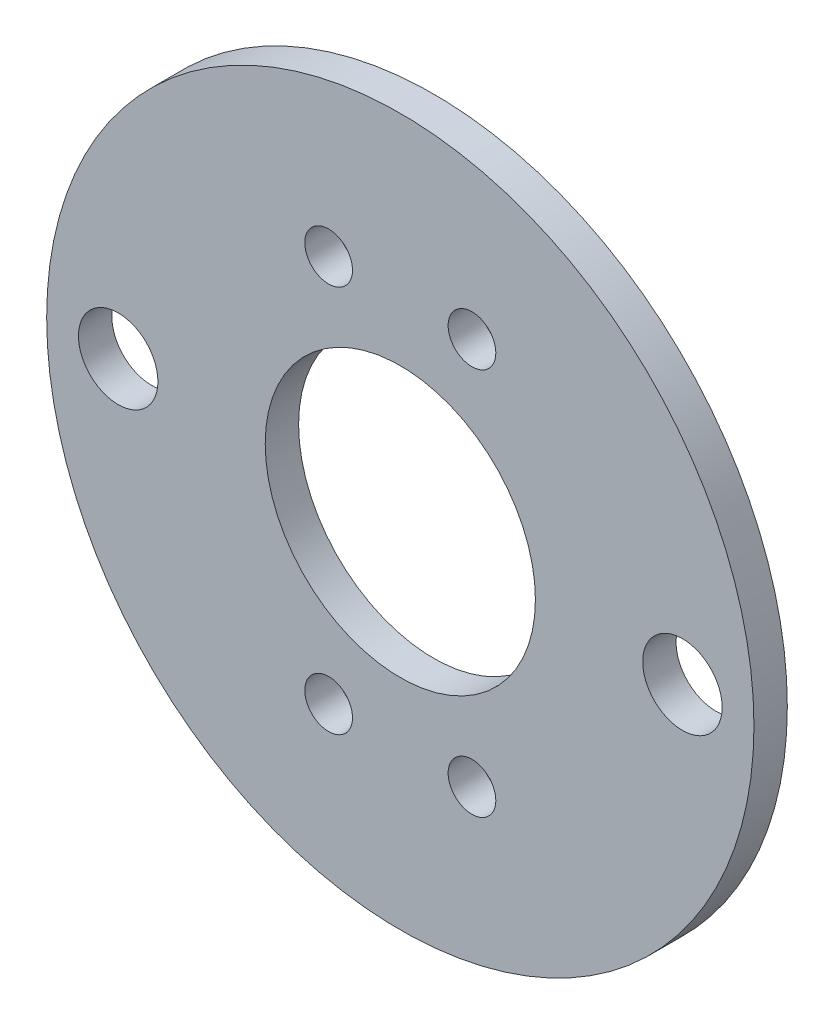
ISO-10303-21;
HEADER;
FILE_DESCRIPTION(('STEP AP214'),'2;1');
FILE_NAME('part.step','',(''),(''),'','','');
FILE_SCHEMA(('AUTOMOTIVE_DESIGN { 1 0 10303 214 1 1 1 1 }'));
ENDSEC;
DATA;
#1=APPLICATION_CONTEXT('core data for automotive mechanical design processes');
#2=APPLICATION_PROTOCOL_DEFINITION('international standard','automotive_design',2000,#1);
#3=PRODUCT_CONTEXT('',#1,'mechanical');
#4=PRODUCT('Part','Part','',(#3));
#5=PRODUCT_RELATED_PRODUCT_CATEGORY('part','',(#4));
#6=PRODUCT_DEFINITION_FORMATION('','',#4);
#7=PRODUCT_DEFINITION_CONTEXT('part definition',#1,'design');
#8=PRODUCT_DEFINITION('design','',#6,#7);
#9=PRODUCT_DEFINITION_SHAPE('','',#8);
#10=(LENGTH_UNIT() NAMED_UNIT(*) SI_UNIT(.MILLI.,.METRE.));
#11=(NAMED_UNIT(*) PLANE_ANGLE_UNIT() SI_UNIT($,.RADIAN.));
#12=(NAMED_UNIT(*) SI_UNIT($,.STERADIAN.) SOLID_ANGLE_UNIT());
#13=UNCERTAINTY_MEASURE_WITH_UNIT(LENGTH_MEASURE(1.E-05),#10,'distance_accuracy_value','');
#14=(GEOMETRIC_REPRESENTATION_CONTEXT(3) GLOBAL_UNCERTAINTY_ASSIGNED_CONTEXT((#13)) GLOBAL_UNIT_ASSIGNED_CONTEXT((#10,
#11,#12)) REPRESENTATION_CONTEXT('',''));
#15=CARTESIAN_POINT('',(0.,0.,0.));
#16=DIRECTION('',(0.,0.,1.));
#17=DIRECTION('',(1.,0.,0.));
#18=AXIS2_PLACEMENT_3D('',#15,#16,#17);
#19=CARTESIAN_POINT('',(1.09092304692803E-13,0.,2.1));
#20=DIRECTION('',(0.,0.,-1.));
#21=DIRECTION('',(-1.,0.,0.));
#22=AXIS2_PLACEMENT_3D('',#19,#20,#21);
#23=CYLINDRICAL_SURFACE('',#22,8.50000000000012);
#24=CARTESIAN_POINT('',(1.09092304692803E-13,0.,2.1));
#25=DIRECTION('',(0.,0.,1.));
#26=DIRECTION('',(1.,0.,0.));
#27=AXIS2_PLACEMENT_3D('',#24,#25,#26);
#28=CIRCLE('',#27,8.50000000000012);
#29=CARTESIAN_POINT('',(8.50000000000023,0.,2.1));
#30=VERTEX_POINT('',#29);
#31=EDGE_CURVE('E40',#30,#30,#28,.T.);
#32=ORIENTED_EDGE('',*,*,#31,.T.);
#33=EDGE_LOOP('',(#32));
#34=FACE_BOUND('',#33,.T.);
#35=CARTESIAN_POINT('',(1.09092304692803E-13,0.,0.));
#36=DIRECTION('',(0.,0.,1.));
#37=DIRECTION('',(1.,0.,0.));
#38=AXIS2_PLACEMENT_3D('',#35,#36,#37);
#39=CIRCLE('',#38,8.50000000000012);
#40=CARTESIAN_POINT('',(8.50000000000023,0.,0.));
#41=VERTEX_POINT('',#40);
#42=EDGE_CURVE('E55',#41,#41,#39,.T.);
#43=ORIENTED_EDGE('',*,*,#42,.F.);
#44=EDGE_LOOP('',(#43));
#45=FACE_BOUND('',#44,.T.);
#46=ADVANCED_FACE('F32',(#34,#45),#23,.F.);
#47=CARTESIAN_POINT('',(17.7499999999999,0.,2.1));
#48=DIRECTION('',(0.,0.,-1.));
#49=DIRECTION('',(-1.,0.,0.));
#50=AXIS2_PLACEMENT_3D('',#47,#48,#49);
#51=CYLINDRICAL_SURFACE('',#50,2.5);
#52=CARTESIAN_POINT('',(17.7499999999999,0.,2.1));
#53=DIRECTION('',(0.,0.,1.));
#54=DIRECTION('',(1.,0.,0.));
#55=AXIS2_PLACEMENT_3D('',#52,#53,#54);
#56=CIRCLE('',#55,2.5);
#57=CARTESIAN_POINT('',(20.2499999999999,0.,2.1));
#58=VERTEX_POINT('',#57);
#59=EDGE_CURVE('E45',#58,#58,#56,.T.);
#60=ORIENTED_EDGE('',*,*,#59,.T.);
#61=EDGE_LOOP('',(#60));
#62=FACE_BOUND('',#61,.T.);
#63=CARTESIAN_POINT('',(17.7499999999999,0.,0.));
#64=DIRECTION('',(0.,0.,1.));
#65=DIRECTION('',(1.,0.,0.));
#66=AXIS2_PLACEMENT_3D('',#63,#64,#65);
#67=CIRCLE('',#66,2.5);
#68=CARTESIAN_POINT('',(20.2499999999999,0.,0.));
#69=VERTEX_POINT('',#68);
#70=EDGE_CURVE('E52',#69,#69,#67,.T.);
#71=ORIENTED_EDGE('',*,*,#70,.F.);
#72=EDGE_LOOP('',(#71));
#73=FACE_BOUND('',#72,.T.);
#74=ADVANCED_FACE('F91',(#62,#73),#51,.F.);
#75=CARTESIAN_POINT('',(-17.7499999999997,0.,2.1));
#76=DIRECTION('',(0.,0.,-1.));
#77=DIRECTION('',(-1.,0.,0.));
#78=AXIS2_PLACEMENT_3D('',#75,#76,#77);
#79=CYLINDRICAL_SURFACE('',#78,2.5);
#80=CARTESIAN_POINT('',(-17.7499999999997,0.,2.1));
#81=DIRECTION('',(0.,0.,1.));
#82=DIRECTION('',(1.,0.,0.));
#83=AXIS2_PLACEMENT_3D('',#80,#81,#82);
#84=CIRCLE('',#83,2.5);
#85=CARTESIAN_POINT('',(-15.2499999999997,0.,2.1));
#86=VERTEX_POINT('',#85);
#87=EDGE_CURVE('E61',#86,#86,#84,.T.);
#88=ORIENTED_EDGE('',*,*,#87,.T.);
#89=EDGE_LOOP('',(#88));
#90=FACE_BOUND('',#89,.T.);
#91=CARTESIAN_POINT('',(-17.7499999999997,0.,0.));
#92=DIRECTION('',(0.,0.,1.));
#93=DIRECTION('',(1.,0.,0.));
#94=AXIS2_PLACEMENT_3D('',#91,#92,#93);
#95=CIRCLE('',#94,2.5);
#96=CARTESIAN_POINT('',(-15.2499999999997,0.,0.));
#97=VERTEX_POINT('',#96);
#98=EDGE_CURVE('E49',#97,#97,#95,.T.);
#99=ORIENTED_EDGE('',*,*,#98,.F.);
#100=EDGE_LOOP('',(#99));
#101=FACE_BOUND('',#100,.T.);
#102=ADVANCED_FACE('F34',(#90,#101),#79,.F.);
#103=CARTESIAN_POINT('',(1.09092304692803E-13,0.,2.1));
#104=DIRECTION('',(0.,0.,-1.));
#105=DIRECTION('',(-1.,0.,0.));
#106=AXIS2_PLACEMENT_3D('',#103,#104,#105);
#107=CYLINDRICAL_SURFACE('',#106,22.2499999999998);
#108=CARTESIAN_POINT('',(1.09092304692803E-13,0.,2.1));
#109=DIRECTION('',(0.,0.,1.));
#110=DIRECTION('',(1.,0.,0.));
#111=AXIS2_PLACEMENT_3D('',#108,#109,#110);
#112=CIRCLE('',#111,22.2499999999998);
#113=CARTESIAN_POINT('',(22.2499999999999,0.,2.1));
#114=VERTEX_POINT('',#113);
#115=EDGE_CURVE('E10',#114,#114,#112,.T.);
#116=ORIENTED_EDGE('',*,*,#115,.F.);
#117=EDGE_LOOP('',(#116));
#118=FACE_BOUND('',#117,.T.);
#119=CARTESIAN_POINT('',(1.09092304692803E-13,0.,0.));
#120=DIRECTION('',(0.,0.,1.));
#121=DIRECTION('',(1.,0.,0.));
#122=AXIS2_PLACEMENT_3D('',#119,#120,#121);
#123=CIRCLE('',#122,22.2499999999998);
#124=CARTESIAN_POINT('',(22.2499999999999,0.,0.));
#125=VERTEX_POINT('',#124);
#126=EDGE_CURVE('E58',#125,#125,#123,.T.);
#127=ORIENTED_EDGE('',*,*,#126,.T.);
#128=EDGE_LOOP('',(#127));
#129=FACE_BOUND('',#128,.T.);
#130=ADVANCED_FACE('F100',(#118,#129),#107,.T.);
#131=CARTESIAN_POINT('',(0.,0.,2.1));
#132=DIRECTION('',(0.,0.,1.));
#133=DIRECTION('',(1.,0.,0.));
#134=AXIS2_PLACEMENT_3D('',#131,#132,#133);
#135=PLANE('',#134);
#136=CARTESIAN_POINT('',(4.50880281690134,12.1930593846788,2.1));
#137=DIRECTION('',(0.,0.,1.));
#138=DIRECTION('',(-1.,0.,0.));
#139=AXIS2_PLACEMENT_3D('',#136,#137,#138);
#140=CIRCLE('',#139,1.5);
#141=CARTESIAN_POINT('',(6.00880281690134,12.1930593846788,2.1));
#142=VERTEX_POINT('',#141);
#143=EDGE_CURVE('E144',#142,#142,#140,.T.);
#144=ORIENTED_EDGE('',*,*,#143,.F.);
#145=EDGE_LOOP('',(#144));
#146=FACE_BOUND('',#145,.T.);
#147=CARTESIAN_POINT('',(-4.50880281690134,-12.1930593846788,2.1));
#148=DIRECTION('',(0.,0.,1.));
#149=DIRECTION('',(-1.,0.,0.));
#150=AXIS2_PLACEMENT_3D('',#147,#148,#149);
#151=CIRCLE('',#150,1.5);
#152=CARTESIAN_POINT('',(-3.00880281690134,-12.1930593846788,2.1));
#153=VERTEX_POINT('',#152);
#154=EDGE_CURVE('E145',#153,#153,#151,.T.);
#155=ORIENTED_EDGE('',*,*,#154,.F.);
#156=EDGE_LOOP('',(#155));
#157=FACE_BOUND('',#156,.T.);
#158=CARTESIAN_POINT('',(-4.50880281690134,12.1930593846788,2.1));
#159=DIRECTION('',(0.,0.,1.));
#160=DIRECTION('',(1.,0.,0.));
#161=AXIS2_PLACEMENT_3D('',#158,#159,#160);
#162=CIRCLE('',#161,1.5);
#163=CARTESIAN_POINT('',(-3.00880281690134,12.1930593846788,2.1));
#164=VERTEX_POINT('',#163);
#165=EDGE_CURVE('E148',#164,#164,#162,.T.);
#166=ORIENTED_EDGE('',*,*,#165,.F.);
#167=EDGE_LOOP('',(#166));
#168=FACE_BOUND('',#167,.T.);
#169=CARTESIAN_POINT('',(4.50880281690134,-12.1930593846788,2.1));
#170=DIRECTION('',(0.,0.,1.));
#171=DIRECTION('',(1.,0.,0.));
#172=AXIS2_PLACEMENT_3D('',#169,#170,#171);
#173=CIRCLE('',#172,1.5);
#174=CARTESIAN_POINT('',(6.00880281690134,-12.1930593846788,2.1));
#175=VERTEX_POINT('',#174);
#176=EDGE_CURVE('E66',#175,#175,#173,.T.);
#177=ORIENTED_EDGE('',*,*,#176,.F.);
#178=EDGE_LOOP('',(#177));
#179=FACE_BOUND('',#178,.T.);
#180=ORIENTED_EDGE('',*,*,#87,.F.);
#181=EDGE_LOOP('',(#180));
#182=FACE_BOUND('',#181,.T.);
#183=ORIENTED_EDGE('',*,*,#59,.F.);
#184=EDGE_LOOP('',(#183));
#185=FACE_BOUND('',#184,.T.);
#186=ORIENTED_EDGE('',*,*,#31,.F.);
#187=EDGE_LOOP('',(#186));
#188=FACE_BOUND('',#187,.T.);
#189=ORIENTED_EDGE('',*,*,#115,.T.);
#190=EDGE_LOOP('',(#189));
#191=FACE_BOUND('',#190,.T.);
#192=ADVANCED_FACE('F103',(#146,#157,#168,#179,#182,#185,#188,#191),#135,.T.);
#193=CARTESIAN_POINT('',(0.,0.,0.));
#194=DIRECTION('',(0.,0.,1.));
#195=DIRECTION('',(1.,0.,0.));
#196=AXIS2_PLACEMENT_3D('',#193,#194,#195);
#197=PLANE('',#196);
#198=CARTESIAN_POINT('',(4.50880281690134,12.1930593846788,0.));
#199=DIRECTION('',(0.,0.,1.));
#200=DIRECTION('',(1.,0.,0.));
#201=AXIS2_PLACEMENT_3D('',#198,#199,#200);
#202=CIRCLE('',#201,1.5);
#203=CARTESIAN_POINT('',(6.00880281690134,12.1930593846788,0.));
#204=VERTEX_POINT('',#203);
#205=EDGE_CURVE('E36',#204,#204,#202,.T.);
#206=ORIENTED_EDGE('',*,*,#205,.T.);
#207=EDGE_LOOP('',(#206));
#208=FACE_BOUND('',#207,.T.);
#209=CARTESIAN_POINT('',(-4.50880281690134,-12.1930593846788,0.));
#210=DIRECTION('',(0.,0.,1.));
#211=DIRECTION('',(1.,0.,0.));
#212=AXIS2_PLACEMENT_3D('',#209,#210,#211);
#213=CIRCLE('',#212,1.5);
#214=CARTESIAN_POINT('',(-3.00880281690134,-12.1930593846788,0.));
#215=VERTEX_POINT('',#214);
#216=EDGE_CURVE('E68',#215,#215,#213,.T.);
#217=ORIENTED_EDGE('',*,*,#216,.T.);
#218=EDGE_LOOP('',(#217));
#219=FACE_BOUND('',#218,.T.);
#220=CARTESIAN_POINT('',(-4.50880281690134,12.1930593846788,0.));
#221=DIRECTION('',(0.,0.,1.));
#222=DIRECTION('',(1.,0.,0.));
#223=AXIS2_PLACEMENT_3D('',#220,#221,#222);
#224=CIRCLE('',#223,1.5);
#225=CARTESIAN_POINT('',(-3.00880281690134,12.1930593846788,0.));
#226=VERTEX_POINT('',#225);
#227=EDGE_CURVE('E65',#226,#226,#224,.T.);
#228=ORIENTED_EDGE('',*,*,#227,.T.);
#229=EDGE_LOOP('',(#228));
#230=FACE_BOUND('',#229,.T.);
#231=CARTESIAN_POINT('',(4.50880281690134,-12.1930593846788,0.));
#232=DIRECTION('',(0.,0.,1.));
#233=DIRECTION('',(1.,0.,0.));
#234=AXIS2_PLACEMENT_3D('',#231,#232,#233);
#235=CIRCLE('',#234,1.5);
#236=CARTESIAN_POINT('',(6.00880281690134,-12.1930593846788,0.));
#237=VERTEX_POINT('',#236);
#238=EDGE_CURVE('E62',#237,#237,#235,.T.);
#239=ORIENTED_EDGE('',*,*,#238,.T.);
#240=EDGE_LOOP('',(#239));
#241=FACE_BOUND('',#240,.T.);
#242=ORIENTED_EDGE('',*,*,#98,.T.);
#243=EDGE_LOOP('',(#242));
#244=FACE_BOUND('',#243,.T.);
#245=ORIENTED_EDGE('',*,*,#70,.T.);
#246=EDGE_LOOP('',(#245));
#247=FACE_BOUND('',#246,.T.);
#248=ORIENTED_EDGE('',*,*,#42,.T.);
#249=EDGE_LOOP('',(#248));
#250=FACE_BOUND('',#249,.T.);
#251=ORIENTED_EDGE('',*,*,#126,.F.);
#252=EDGE_LOOP('',(#251));
#253=FACE_BOUND('',#252,.T.);
#254=ADVANCED_FACE('F75',(#208,#219,#230,#241,#244,#247,#250,#253),#197,.F.);
#255=CARTESIAN_POINT('',(4.50880281690134,-12.1930593846788,-1.2E-05));
#256=DIRECTION('',(0.,0.,1.));
#257=DIRECTION('',(1.,0.,0.));
#258=AXIS2_PLACEMENT_3D('',#255,#256,#257);
#259=CYLINDRICAL_SURFACE('',#258,1.5);
#260=CARTESIAN_POINT('',(6.00880281690134,-12.1930593846788,2.1));
#261=CARTESIAN_POINT('',(6.00880281690134,-12.1930593846788,2.078125));
#262=CARTESIAN_POINT('',(6.00880281690134,-12.1930593846788,2.05625));
#263=CARTESIAN_POINT('',(6.00880281690134,-12.1930593846788,2.0125));
#264=CARTESIAN_POINT('',(6.00880281690134,-12.1930593846788,1.990625));
#265=CARTESIAN_POINT('',(6.00880281690134,-12.1930593846788,1.946875));
#266=CARTESIAN_POINT('',(6.00880281690134,-12.1930593846788,1.925));
#267=CARTESIAN_POINT('',(6.00880281690134,-12.1930593846788,1.88125));
#268=CARTESIAN_POINT('',(6.00880281690134,-12.1930593846788,1.859375));
#269=CARTESIAN_POINT('',(6.00880281690134,-12.1930593846788,1.815625));
#270=CARTESIAN_POINT('',(6.00880281690134,-12.1930593846788,1.79375));
#271=CARTESIAN_POINT('',(6.00880281690134,-12.1930593846788,1.75));
#272=CARTESIAN_POINT('',(6.00880281690134,-12.1930593846788,1.728125));
#273=CARTESIAN_POINT('',(6.00880281690134,-12.1930593846788,1.684375));
#274=CARTESIAN_POINT('',(6.00880281690134,-12.1930593846788,1.6625));
#275=CARTESIAN_POINT('',(6.00880281690134,-12.1930593846788,1.61875));
#276=CARTESIAN_POINT('',(6.00880281690134,-12.1930593846788,1.596875));
#277=CARTESIAN_POINT('',(6.00880281690134,-12.1930593846788,1.553125));
#278=CARTESIAN_POINT('',(6.00880281690134,-12.1930593846788,1.53125));
#279=CARTESIAN_POINT('',(6.00880281690134,-12.1930593846788,1.4875));
#280=CARTESIAN_POINT('',(6.00880281690134,-12.1930593846788,1.465625));
#281=CARTESIAN_POINT('',(6.00880281690134,-12.1930593846788,1.421875));
#282=CARTESIAN_POINT('',(6.00880281690134,-12.1930593846788,1.4));
#283=CARTESIAN_POINT('',(6.00880281690134,-12.1930593846788,1.35625));
#284=CARTESIAN_POINT('',(6.00880281690134,-12.1930593846788,1.334375));
#285=CARTESIAN_POINT('',(6.00880281690134,-12.1930593846788,1.290625));
#286=CARTESIAN_POINT('',(6.00880281690134,-12.1930593846788,1.26875));
#287=CARTESIAN_POINT('',(6.00880281690134,-12.1930593846788,1.225));
#288=CARTESIAN_POINT('',(6.00880281690134,-12.1930593846788,1.203125));
#289=CARTESIAN_POINT('',(6.00880281690134,-12.1930593846788,1.159375));
#290=CARTESIAN_POINT('',(6.00880281690134,-12.1930593846788,1.1375));
#291=CARTESIAN_POINT('',(6.00880281690134,-12.1930593846788,1.09375));
#292=CARTESIAN_POINT('',(6.00880281690134,-12.1930593846788,1.071875));
#293=CARTESIAN_POINT('',(6.00880281690134,-12.1930593846788,1.028125));
#294=CARTESIAN_POINT('',(6.00880281690134,-12.1930593846788,1.00625));
#295=CARTESIAN_POINT('',(6.00880281690134,-12.1930593846788,0.9625));
#296=CARTESIAN_POINT('',(6.00880281690134,-12.1930593846788,0.940625));
#297=CARTESIAN_POINT('',(6.00880281690134,-12.1930593846788,0.896875));
#298=CARTESIAN_POINT('',(6.00880281690134,-12.1930593846788,0.875));
#299=CARTESIAN_POINT('',(6.00880281690134,-12.1930593846788,0.83125));
#300=CARTESIAN_POINT('',(6.00880281690134,-12.1930593846788,0.809375));
#301=CARTESIAN_POINT('',(6.00880281690134,-12.1930593846788,0.765625));
#302=CARTESIAN_POINT('',(6.00880281690134,-12.1930593846788,0.74375));
#303=CARTESIAN_POINT('',(6.00880281690134,-12.1930593846788,0.7));
#304=CARTESIAN_POINT('',(6.00880281690134,-12.1930593846788,0.678125));
#305=CARTESIAN_POINT('',(6.00880281690134,-12.1930593846788,0.634375));
#306=CARTESIAN_POINT('',(6.00880281690134,-12.1930593846788,0.6125));
#307=CARTESIAN_POINT('',(6.00880281690134,-12.1930593846788,0.56875));
#308=CARTESIAN_POINT('',(6.00880281690134,-12.1930593846788,0.546875));
#309=CARTESIAN_POINT('',(6.00880281690134,-12.1930593846788,0.503125));
#310=CARTESIAN_POINT('',(6.00880281690134,-12.1930593846788,0.48125));
#311=CARTESIAN_POINT('',(6.00880281690134,-12.1930593846788,0.4375));
#312=CARTESIAN_POINT('',(6.00880281690134,-12.1930593846788,0.415625));
#313=CARTESIAN_POINT('',(6.00880281690134,-12.1930593846788,0.371875));
#314=CARTESIAN_POINT('',(6.00880281690134,-12.1930593846788,0.35));
#315=CARTESIAN_POINT('',(6.00880281690134,-12.1930593846788,0.30625));
#316=CARTESIAN_POINT('',(6.00880281690134,-12.1930593846788,0.284375));
#317=CARTESIAN_POINT('',(6.00880281690134,-12.1930593846788,0.240625));
#318=CARTESIAN_POINT('',(6.00880281690134,-12.1930593846788,0.21875));
#319=CARTESIAN_POINT('',(6.00880281690134,-12.1930593846788,0.175));
#320=CARTESIAN_POINT('',(6.00880281690134,-12.1930593846788,0.153125));
#321=CARTESIAN_POINT('',(6.00880281690134,-12.1930593846788,0.109375));
#322=CARTESIAN_POINT('',(6.00880281690134,-12.1930593846788,0.0875000000000002));
#323=CARTESIAN_POINT('',(6.00880281690134,-12.1930593846788,0.0437500000000003));
#324=CARTESIAN_POINT('',(6.00880281690134,-12.1930593846788,0.0218750000000003));
#325=CARTESIAN_POINT('',(6.00880281690134,-12.1930593846788,0.));
#326=B_SPLINE_CURVE_WITH_KNOTS('',3,(#260,#261,#262,#263,#264,#265,#266,#267,#268,#269,#270,
#271,#272,#273,#274,#275,#276,#277,#278,#279,#280,#281,#282,#283,#284,#285,#286,#287,#288,#289,
#290,#291,#292,#293,#294,#295,#296,#297,#298,#299,#300,#301,#302,#303,#304,#305,#306,#307,#308,
#309,#310,#311,#312,#313,#314,#315,#316,#317,#318,#319,#320,#321,#322,#323,#324,#325),
.UNSPECIFIED.,.F.,.F.,(4,2,2,2,2,2,2,2,2,2,2,2,2,2,2,2,2,2,2,2,2,2,2,2,2,2,2,2,2,2,2,2,4),(0.,
0.0656250000000001,0.13125,0.196875,0.2625,0.328125,0.39375,0.459375,0.525,0.590625,0.65625,
0.721875,0.7875,0.853125,0.91875,0.984375,1.05,1.115625,1.18125,1.246875,1.3125,1.378125,
1.44375,1.509375,1.575,1.640625,1.70625,1.771875,1.8375,1.903125,1.96875,2.034375,2.1),.UNSPECIFIED.);
#327=EDGE_CURVE('BSEAM107',#175,#237,#326,.T.);
#328=ORIENTED_EDGE('',*,*,#176,.T.);
#329=ORIENTED_EDGE('',*,*,#238,.F.);
#330=ORIENTED_EDGE('',*,*,#327,.T.);
#331=ORIENTED_EDGE('',*,*,#327,.F.);
#332=EDGE_LOOP('',(#328,#330,#329,#331));
#333=FACE_BOUND('',#332,.T.);
#334=ADVANCED_FACE('F107',(#333),#259,.F.);
#335=CARTESIAN_POINT('',(-4.50880281690134,12.1930593846788,-1.2E-05));
#336=DIRECTION('',(0.,0.,1.));
#337=DIRECTION('',(1.,0.,0.));
#338=AXIS2_PLACEMENT_3D('',#335,#336,#337);
#339=CYLINDRICAL_SURFACE('',#338,1.5);
#340=CARTESIAN_POINT('',(-3.00880281690134,12.1930593846788,2.1));
#341=CARTESIAN_POINT('',(-3.00880281690134,12.1930593846788,2.078125));
#342=CARTESIAN_POINT('',(-3.00880281690134,12.1930593846788,2.05625));
#343=CARTESIAN_POINT('',(-3.00880281690134,12.1930593846788,2.0125));
#344=CARTESIAN_POINT('',(-3.00880281690134,12.1930593846788,1.990625));
#345=CARTESIAN_POINT('',(-3.00880281690134,12.1930593846788,1.946875));
#346=CARTESIAN_POINT('',(-3.00880281690134,12.1930593846788,1.925));
#347=CARTESIAN_POINT('',(-3.00880281690134,12.1930593846788,1.88125));
#348=CARTESIAN_POINT('',(-3.00880281690134,12.1930593846788,1.859375));
#349=CARTESIAN_POINT('',(-3.00880281690134,12.1930593846788,1.815625));
#350=CARTESIAN_POINT('',(-3.00880281690134,12.1930593846788,1.79375));
#351=CARTESIAN_POINT('',(-3.00880281690134,12.1930593846788,1.75));
#352=CARTESIAN_POINT('',(-3.00880281690134,12.1930593846788,1.728125));
#353=CARTESIAN_POINT('',(-3.00880281690134,12.1930593846788,1.684375));
#354=CARTESIAN_POINT('',(-3.00880281690134,12.1930593846788,1.6625));
#355=CARTESIAN_POINT('',(-3.00880281690134,12.1930593846788,1.61875));
#356=CARTESIAN_POINT('',(-3.00880281690134,12.1930593846788,1.596875));
#357=CARTESIAN_POINT('',(-3.00880281690134,12.1930593846788,1.553125));
#358=CARTESIAN_POINT('',(-3.00880281690134,12.1930593846788,1.53125));
#359=CARTESIAN_POINT('',(-3.00880281690134,12.1930593846788,1.4875));
#360=CARTESIAN_POINT('',(-3.00880281690134,12.1930593846788,1.465625));
#361=CARTESIAN_POINT('',(-3.00880281690134,12.1930593846788,1.421875));
#362=CARTESIAN_POINT('',(-3.00880281690134,12.1930593846788,1.4));
#363=CARTESIAN_POINT('',(-3.00880281690134,12.1930593846788,1.35625));
#364=CARTESIAN_POINT('',(-3.00880281690134,12.1930593846788,1.334375));
#365=CARTESIAN_POINT('',(-3.00880281690134,12.1930593846788,1.290625));
#366=CARTESIAN_POINT('',(-3.00880281690134,12.1930593846788,1.26875));
#367=CARTESIAN_POINT('',(-3.00880281690134,12.1930593846788,1.225));
#368=CARTESIAN_POINT('',(-3.00880281690134,12.1930593846788,1.203125));
#369=CARTESIAN_POINT('',(-3.00880281690134,12.1930593846788,1.159375));
#370=CARTESIAN_POINT('',(-3.00880281690134,12.1930593846788,1.1375));
#371=CARTESIAN_POINT('',(-3.00880281690134,12.1930593846788,1.09375));
#372=CARTESIAN_POINT('',(-3.00880281690134,12.1930593846788,1.071875));
#373=CARTESIAN_POINT('',(-3.00880281690134,12.1930593846788,1.028125));
#374=CARTESIAN_POINT('',(-3.00880281690134,12.1930593846788,1.00625));
#375=CARTESIAN_POINT('',(-3.00880281690134,12.1930593846788,0.9625));
#376=CARTESIAN_POINT('',(-3.00880281690134,12.1930593846788,0.940625));
#377=CARTESIAN_POINT('',(-3.00880281690134,12.1930593846788,0.896875));
#378=CARTESIAN_POINT('',(-3.00880281690134,12.1930593846788,0.875));
#379=CARTESIAN_POINT('',(-3.00880281690134,12.1930593846788,0.83125));
#380=CARTESIAN_POINT('',(-3.00880281690134,12.1930593846788,0.809375));
#381=CARTESIAN_POINT('',(-3.00880281690134,12.1930593846788,0.765625));
#382=CARTESIAN_POINT('',(-3.00880281690134,12.1930593846788,0.74375));
#383=CARTESIAN_POINT('',(-3.00880281690134,12.1930593846788,0.7));
#384=CARTESIAN_POINT('',(-3.00880281690134,12.1930593846788,0.678125));
#385=CARTESIAN_POINT('',(-3.00880281690134,12.1930593846788,0.634375));
#386=CARTESIAN_POINT('',(-3.00880281690134,12.1930593846788,0.6125));
#387=CARTESIAN_POINT('',(-3.00880281690134,12.1930593846788,0.56875));
#388=CARTESIAN_POINT('',(-3.00880281690134,12.1930593846788,0.546875));
#389=CARTESIAN_POINT('',(-3.00880281690134,12.1930593846788,0.503125));
#390=CARTESIAN_POINT('',(-3.00880281690134,12.1930593846788,0.48125));
#391=CARTESIAN_POINT('',(-3.00880281690134,12.1930593846788,0.4375));
#392=CARTESIAN_POINT('',(-3.00880281690134,12.1930593846788,0.415625));
#393=CARTESIAN_POINT('',(-3.00880281690134,12.1930593846788,0.371875));
#394=CARTESIAN_POINT('',(-3.00880281690134,12.1930593846788,0.35));
#395=CARTESIAN_POINT('',(-3.00880281690134,12.1930593846788,0.30625));
#396=CARTESIAN_POINT('',(-3.00880281690134,12.1930593846788,0.284375));
#397=CARTESIAN_POINT('',(-3.00880281690134,12.1930593846788,0.240625));
#398=CARTESIAN_POINT('',(-3.00880281690134,12.1930593846788,0.21875));
#399=CARTESIAN_POINT('',(-3.00880281690134,12.1930593846788,0.175));
#400=CARTESIAN_POINT('',(-3.00880281690134,12.1930593846788,0.153125));
#401=CARTESIAN_POINT('',(-3.00880281690134,12.1930593846788,0.109375));
#402=CARTESIAN_POINT('',(-3.00880281690134,12.1930593846788,0.0875000000000002));
#403=CARTESIAN_POINT('',(-3.00880281690134,12.1930593846788,0.0437500000000003));
#404=CARTESIAN_POINT('',(-3.00880281690134,12.1930593846788,0.0218750000000003));
#405=CARTESIAN_POINT('',(-3.00880281690134,12.1930593846788,0.));
#406=B_SPLINE_CURVE_WITH_KNOTS('',3,(#340,#341,#342,#343,#344,#345,#346,#347,#348,#349,#350,
#351,#352,#353,#354,#355,#356,#357,#358,#359,#360,#361,#362,#363,#364,#365,#366,#367,#368,#369,
#370,#371,#372,#373,#374,#375,#376,#377,#378,#379,#380,#381,#382,#383,#384,#385,#386,#387,#388,
#389,#390,#391,#392,#393,#394,#395,#396,#397,#398,#399,#400,#401,#402,#403,#404,#405),
.UNSPECIFIED.,.F.,.F.,(4,2,2,2,2,2,2,2,2,2,2,2,2,2,2,2,2,2,2,2,2,2,2,2,2,2,2,2,2,2,2,2,4),(0.,
0.0656250000000001,0.13125,0.196875,0.2625,0.328125,0.39375,0.459375,0.525,0.590625,0.65625,
0.721875,0.7875,0.853125,0.91875,0.984375,1.05,1.115625,1.18125,1.246875,1.3125,1.378125,
1.44375,1.509375,1.575,1.640625,1.70625,1.771875,1.8375,1.903125,1.96875,2.034375,2.1),.UNSPECIFIED.);
#407=EDGE_CURVE('BSEAM85',#164,#226,#406,.T.);
#408=ORIENTED_EDGE('',*,*,#165,.T.);
#409=ORIENTED_EDGE('',*,*,#227,.F.);
#410=ORIENTED_EDGE('',*,*,#407,.T.);
#411=ORIENTED_EDGE('',*,*,#407,.F.);
#412=EDGE_LOOP('',(#408,#410,#409,#411));
#413=FACE_BOUND('',#412,.T.);
#414=ADVANCED_FACE('F85',(#413),#339,.F.);
#415=CARTESIAN_POINT('',(-4.50880281690134,-12.1930593846788,-1.2E-05));
#416=DIRECTION('',(0.,0.,1.));
#417=DIRECTION('',(1.,0.,0.));
#418=AXIS2_PLACEMENT_3D('',#415,#416,#417);
#419=CYLINDRICAL_SURFACE('',#418,1.5);
#420=CARTESIAN_POINT('',(-3.00880281690134,-12.1930593846788,2.1));
#421=CARTESIAN_POINT('',(-3.00880281690134,-12.1930593846788,2.078125));
#422=CARTESIAN_POINT('',(-3.00880281690134,-12.1930593846788,2.05625));
#423=CARTESIAN_POINT('',(-3.00880281690134,-12.1930593846788,2.0125));
#424=CARTESIAN_POINT('',(-3.00880281690134,-12.1930593846788,1.990625));
#425=CARTESIAN_POINT('',(-3.00880281690134,-12.1930593846788,1.946875));
#426=CARTESIAN_POINT('',(-3.00880281690134,-12.1930593846788,1.925));
#427=CARTESIAN_POINT('',(-3.00880281690134,-12.1930593846788,1.88125));
#428=CARTESIAN_POINT('',(-3.00880281690134,-12.1930593846788,1.859375));
#429=CARTESIAN_POINT('',(-3.00880281690134,-12.1930593846788,1.815625));
#430=CARTESIAN_POINT('',(-3.00880281690134,-12.1930593846788,1.79375));
#431=CARTESIAN_POINT('',(-3.00880281690134,-12.1930593846788,1.75));
#432=CARTESIAN_POINT('',(-3.00880281690134,-12.1930593846788,1.728125));
#433=CARTESIAN_POINT('',(-3.00880281690134,-12.1930593846788,1.684375));
#434=CARTESIAN_POINT('',(-3.00880281690134,-12.1930593846788,1.6625));
#435=CARTESIAN_POINT('',(-3.00880281690134,-12.1930593846788,1.61875));
#436=CARTESIAN_POINT('',(-3.00880281690134,-12.1930593846788,1.596875));
#437=CARTESIAN_POINT('',(-3.00880281690134,-12.1930593846788,1.553125));
#438=CARTESIAN_POINT('',(-3.00880281690134,-12.1930593846788,1.53125));
#439=CARTESIAN_POINT('',(-3.00880281690134,-12.1930593846788,1.4875));
#440=CARTESIAN_POINT('',(-3.00880281690134,-12.1930593846788,1.465625));
#441=CARTESIAN_POINT('',(-3.00880281690134,-12.1930593846788,1.421875));
#442=CARTESIAN_POINT('',(-3.00880281690134,-12.1930593846788,1.4));
#443=CARTESIAN_POINT('',(-3.00880281690134,-12.1930593846788,1.35625));
#444=CARTESIAN_POINT('',(-3.00880281690134,-12.1930593846788,1.334375));
#445=CARTESIAN_POINT('',(-3.00880281690134,-12.1930593846788,1.290625));
#446=CARTESIAN_POINT('',(-3.00880281690134,-12.1930593846788,1.26875));
#447=CARTESIAN_POINT('',(-3.00880281690134,-12.1930593846788,1.225));
#448=CARTESIAN_POINT('',(-3.00880281690134,-12.1930593846788,1.203125));
#449=CARTESIAN_POINT('',(-3.00880281690134,-12.1930593846788,1.159375));
#450=CARTESIAN_POINT('',(-3.00880281690134,-12.1930593846788,1.1375));
#451=CARTESIAN_POINT('',(-3.00880281690134,-12.1930593846788,1.09375));
#452=CARTESIAN_POINT('',(-3.00880281690134,-12.1930593846788,1.071875));
#453=CARTESIAN_POINT('',(-3.00880281690134,-12.1930593846788,1.028125));
#454=CARTESIAN_POINT('',(-3.00880281690134,-12.1930593846788,1.00625));
#455=CARTESIAN_POINT('',(-3.00880281690134,-12.1930593846788,0.9625));
#456=CARTESIAN_POINT('',(-3.00880281690134,-12.1930593846788,0.940625));
#457=CARTESIAN_POINT('',(-3.00880281690134,-12.1930593846788,0.896875));
#458=CARTESIAN_POINT('',(-3.00880281690134,-12.1930593846788,0.875));
#459=CARTESIAN_POINT('',(-3.00880281690134,-12.1930593846788,0.83125));
#460=CARTESIAN_POINT('',(-3.00880281690134,-12.1930593846788,0.809375));
#461=CARTESIAN_POINT('',(-3.00880281690134,-12.1930593846788,0.765625));
#462=CARTESIAN_POINT('',(-3.00880281690134,-12.1930593846788,0.74375));
#463=CARTESIAN_POINT('',(-3.00880281690134,-12.1930593846788,0.7));
#464=CARTESIAN_POINT('',(-3.00880281690134,-12.1930593846788,0.678125));
#465=CARTESIAN_POINT('',(-3.00880281690134,-12.1930593846788,0.634375));
#466=CARTESIAN_POINT('',(-3.00880281690134,-12.1930593846788,0.6125));
#467=CARTESIAN_POINT('',(-3.00880281690134,-12.1930593846788,0.56875));
#468=CARTESIAN_POINT('',(-3.00880281690134,-12.1930593846788,0.546875));
#469=CARTESIAN_POINT('',(-3.00880281690134,-12.1930593846788,0.503125));
#470=CARTESIAN_POINT('',(-3.00880281690134,-12.1930593846788,0.48125));
#471=CARTESIAN_POINT('',(-3.00880281690134,-12.1930593846788,0.4375));
#472=CARTESIAN_POINT('',(-3.00880281690134,-12.1930593846788,0.415625));
#473=CARTESIAN_POINT('',(-3.00880281690134,-12.1930593846788,0.371875));
#474=CARTESIAN_POINT('',(-3.00880281690134,-12.1930593846788,0.35));
#475=CARTESIAN_POINT('',(-3.00880281690134,-12.1930593846788,0.30625));
#476=CARTESIAN_POINT('',(-3.00880281690134,-12.1930593846788,0.284375));
#477=CARTESIAN_POINT('',(-3.00880281690134,-12.1930593846788,0.240625));
#478=CARTESIAN_POINT('',(-3.00880281690134,-12.1930593846788,0.21875));
#479=CARTESIAN_POINT('',(-3.00880281690134,-12.1930593846788,0.175));
#480=CARTESIAN_POINT('',(-3.00880281690134,-12.1930593846788,0.153125));
#481=CARTESIAN_POINT('',(-3.00880281690134,-12.1930593846788,0.109375));
#482=CARTESIAN_POINT('',(-3.00880281690134,-12.1930593846788,0.0875000000000002));
#483=CARTESIAN_POINT('',(-3.00880281690134,-12.1930593846788,0.0437500000000003));
#484=CARTESIAN_POINT('',(-3.00880281690134,-12.1930593846788,0.0218750000000003));
#485=CARTESIAN_POINT('',(-3.00880281690134,-12.1930593846788,0.));
#486=B_SPLINE_CURVE_WITH_KNOTS('',3,(#420,#421,#422,#423,#424,#425,#426,#427,#428,#429,#430,
#431,#432,#433,#434,#435,#436,#437,#438,#439,#440,#441,#442,#443,#444,#445,#446,#447,#448,#449,
#450,#451,#452,#453,#454,#455,#456,#457,#458,#459,#460,#461,#462,#463,#464,#465,#466,#467,#468,
#469,#470,#471,#472,#473,#474,#475,#476,#477,#478,#479,#480,#481,#482,#483,#484,#485),
.UNSPECIFIED.,.F.,.F.,(4,2,2,2,2,2,2,2,2,2,2,2,2,2,2,2,2,2,2,2,2,2,2,2,2,2,2,2,2,2,2,2,4),(0.,
0.0656250000000001,0.13125,0.196875,0.2625,0.328125,0.39375,0.459375,0.525,0.590625,0.65625,
0.721875,0.7875,0.853125,0.91875,0.984375,1.05,1.115625,1.18125,1.246875,1.3125,1.378125,
1.44375,1.509375,1.575,1.640625,1.70625,1.771875,1.8375,1.903125,1.96875,2.034375,2.1),.UNSPECIFIED.);
#487=EDGE_CURVE('BSEAM79',#153,#215,#486,.T.);
#488=ORIENTED_EDGE('',*,*,#154,.T.);
#489=ORIENTED_EDGE('',*,*,#216,.F.);
#490=ORIENTED_EDGE('',*,*,#487,.T.);
#491=ORIENTED_EDGE('',*,*,#487,.F.);
#492=EDGE_LOOP('',(#488,#490,#489,#491));
#493=FACE_BOUND('',#492,.T.);
#494=ADVANCED_FACE('F79',(#493),#419,.F.);
#495=CARTESIAN_POINT('',(4.50880281690134,12.1930593846788,-1.2E-05));
#496=DIRECTION('',(0.,0.,1.));
#497=DIRECTION('',(1.,0.,0.));
#498=AXIS2_PLACEMENT_3D('',#495,#496,#497);
#499=CYLINDRICAL_SURFACE('',#498,1.5);
#500=CARTESIAN_POINT('',(6.00880281690134,12.1930593846788,2.1));
#501=CARTESIAN_POINT('',(6.00880281690134,12.1930593846788,2.078125));
#502=CARTESIAN_POINT('',(6.00880281690134,12.1930593846788,2.05625));
#503=CARTESIAN_POINT('',(6.00880281690134,12.1930593846788,2.0125));
#504=CARTESIAN_POINT('',(6.00880281690134,12.1930593846788,1.990625));
#505=CARTESIAN_POINT('',(6.00880281690134,12.1930593846788,1.946875));
#506=CARTESIAN_POINT('',(6.00880281690134,12.1930593846788,1.925));
#507=CARTESIAN_POINT('',(6.00880281690134,12.1930593846788,1.88125));
#508=CARTESIAN_POINT('',(6.00880281690134,12.1930593846788,1.859375));
#509=CARTESIAN_POINT('',(6.00880281690134,12.1930593846788,1.815625));
#510=CARTESIAN_POINT('',(6.00880281690134,12.1930593846788,1.79375));
#511=CARTESIAN_POINT('',(6.00880281690134,12.1930593846788,1.75));
#512=CARTESIAN_POINT('',(6.00880281690134,12.1930593846788,1.728125));
#513=CARTESIAN_POINT('',(6.00880281690134,12.1930593846788,1.684375));
#514=CARTESIAN_POINT('',(6.00880281690134,12.1930593846788,1.6625));
#515=CARTESIAN_POINT('',(6.00880281690134,12.1930593846788,1.61875));
#516=CARTESIAN_POINT('',(6.00880281690134,12.1930593846788,1.596875));
#517=CARTESIAN_POINT('',(6.00880281690134,12.1930593846788,1.553125));
#518=CARTESIAN_POINT('',(6.00880281690134,12.1930593846788,1.53125));
#519=CARTESIAN_POINT('',(6.00880281690134,12.1930593846788,1.4875));
#520=CARTESIAN_POINT('',(6.00880281690134,12.1930593846788,1.465625));
#521=CARTESIAN_POINT('',(6.00880281690134,12.1930593846788,1.421875));
#522=CARTESIAN_POINT('',(6.00880281690134,12.1930593846788,1.4));
#523=CARTESIAN_POINT('',(6.00880281690134,12.1930593846788,1.35625));
#524=CARTESIAN_POINT('',(6.00880281690134,12.1930593846788,1.334375));
#525=CARTESIAN_POINT('',(6.00880281690134,12.1930593846788,1.290625));
#526=CARTESIAN_POINT('',(6.00880281690134,12.1930593846788,1.26875));
#527=CARTESIAN_POINT('',(6.00880281690134,12.1930593846788,1.225));
#528=CARTESIAN_POINT('',(6.00880281690134,12.1930593846788,1.203125));
#529=CARTESIAN_POINT('',(6.00880281690134,12.1930593846788,1.159375));
#530=CARTESIAN_POINT('',(6.00880281690134,12.1930593846788,1.1375));
#531=CARTESIAN_POINT('',(6.00880281690134,12.1930593846788,1.09375));
#532=CARTESIAN_POINT('',(6.00880281690134,12.1930593846788,1.071875));
#533=CARTESIAN_POINT('',(6.00880281690134,12.1930593846788,1.028125));
#534=CARTESIAN_POINT('',(6.00880281690134,12.1930593846788,1.00625));
#535=CARTESIAN_POINT('',(6.00880281690134,12.1930593846788,0.9625));
#536=CARTESIAN_POINT('',(6.00880281690134,12.1930593846788,0.940625));
#537=CARTESIAN_POINT('',(6.00880281690134,12.1930593846788,0.896875));
#538=CARTESIAN_POINT('',(6.00880281690134,12.1930593846788,0.875));
#539=CARTESIAN_POINT('',(6.00880281690134,12.1930593846788,0.83125));
#540=CARTESIAN_POINT('',(6.00880281690134,12.1930593846788,0.809375));
#541=CARTESIAN_POINT('',(6.00880281690134,12.1930593846788,0.765625));
#542=CARTESIAN_POINT('',(6.00880281690134,12.1930593846788,0.74375));
#543=CARTESIAN_POINT('',(6.00880281690134,12.1930593846788,0.7));
#544=CARTESIAN_POINT('',(6.00880281690134,12.1930593846788,0.678125));
#545=CARTESIAN_POINT('',(6.00880281690134,12.1930593846788,0.634375));
#546=CARTESIAN_POINT('',(6.00880281690134,12.1930593846788,0.6125));
#547=CARTESIAN_POINT('',(6.00880281690134,12.1930593846788,0.56875));
#548=CARTESIAN_POINT('',(6.00880281690134,12.1930593846788,0.546875));
#549=CARTESIAN_POINT('',(6.00880281690134,12.1930593846788,0.503125));
#550=CARTESIAN_POINT('',(6.00880281690134,12.1930593846788,0.48125));
#551=CARTESIAN_POINT('',(6.00880281690134,12.1930593846788,0.4375));
#552=CARTESIAN_POINT('',(6.00880281690134,12.1930593846788,0.415625));
#553=CARTESIAN_POINT('',(6.00880281690134,12.1930593846788,0.371875));
#554=CARTESIAN_POINT('',(6.00880281690134,12.1930593846788,0.35));
#555=CARTESIAN_POINT('',(6.00880281690134,12.1930593846788,0.30625));
#556=CARTESIAN_POINT('',(6.00880281690134,12.1930593846788,0.284375));
#557=CARTESIAN_POINT('',(6.00880281690134,12.1930593846788,0.240625));
#558=CARTESIAN_POINT('',(6.00880281690134,12.1930593846788,0.21875));
#559=CARTESIAN_POINT('',(6.00880281690134,12.1930593846788,0.175));
#560=CARTESIAN_POINT('',(6.00880281690134,12.1930593846788,0.153125));
#561=CARTESIAN_POINT('',(6.00880281690134,12.1930593846788,0.109375));
#562=CARTESIAN_POINT('',(6.00880281690134,12.1930593846788,0.0875000000000002));
#563=CARTESIAN_POINT('',(6.00880281690134,12.1930593846788,0.0437500000000003));
#564=CARTESIAN_POINT('',(6.00880281690134,12.1930593846788,0.0218750000000003));
#565=CARTESIAN_POINT('',(6.00880281690134,12.1930593846788,0.));
#566=B_SPLINE_CURVE_WITH_KNOTS('',3,(#500,#501,#502,#503,#504,#505,#506,#507,#508,#509,#510,
#511,#512,#513,#514,#515,#516,#517,#518,#519,#520,#521,#522,#523,#524,#525,#526,#527,#528,#529,
#530,#531,#532,#533,#534,#535,#536,#537,#538,#539,#540,#541,#542,#543,#544,#545,#546,#547,#548,
#549,#550,#551,#552,#553,#554,#555,#556,#557,#558,#559,#560,#561,#562,#563,#564,#565),
.UNSPECIFIED.,.F.,.F.,(4,2,2,2,2,2,2,2,2,2,2,2,2,2,2,2,2,2,2,2,2,2,2,2,2,2,2,2,2,2,2,2,4),(0.,
0.0656250000000001,0.13125,0.196875,0.2625,0.328125,0.39375,0.459375,0.525,0.590625,0.65625,
0.721875,0.7875,0.853125,0.91875,0.984375,1.05,1.115625,1.18125,1.246875,1.3125,1.378125,
1.44375,1.509375,1.575,1.640625,1.70625,1.771875,1.8375,1.903125,1.96875,2.034375,2.1),.UNSPECIFIED.);
#567=EDGE_CURVE('BSEAM77',#142,#204,#566,.T.);
#568=ORIENTED_EDGE('',*,*,#143,.T.);
#569=ORIENTED_EDGE('',*,*,#205,.F.);
#570=ORIENTED_EDGE('',*,*,#567,.T.);
#571=ORIENTED_EDGE('',*,*,#567,.F.);
#572=EDGE_LOOP('',(#568,#570,#569,#571));
#573=FACE_BOUND('',#572,.T.);
#574=ADVANCED_FACE('F77',(#573),#499,.F.);
#575=CLOSED_SHELL('',(#46,#74,#102,#130,#192,#254,#334,#414,#494,#574));
#576=MANIFOLD_SOLID_BREP('B2',#575);
#577=ADVANCED_BREP_SHAPE_REPRESENTATION('',(#18,#576),#14);
#578=SHAPE_DEFINITION_REPRESENTATION(#9,#577);
ENDSEC;
END-ISO-10303-21;
